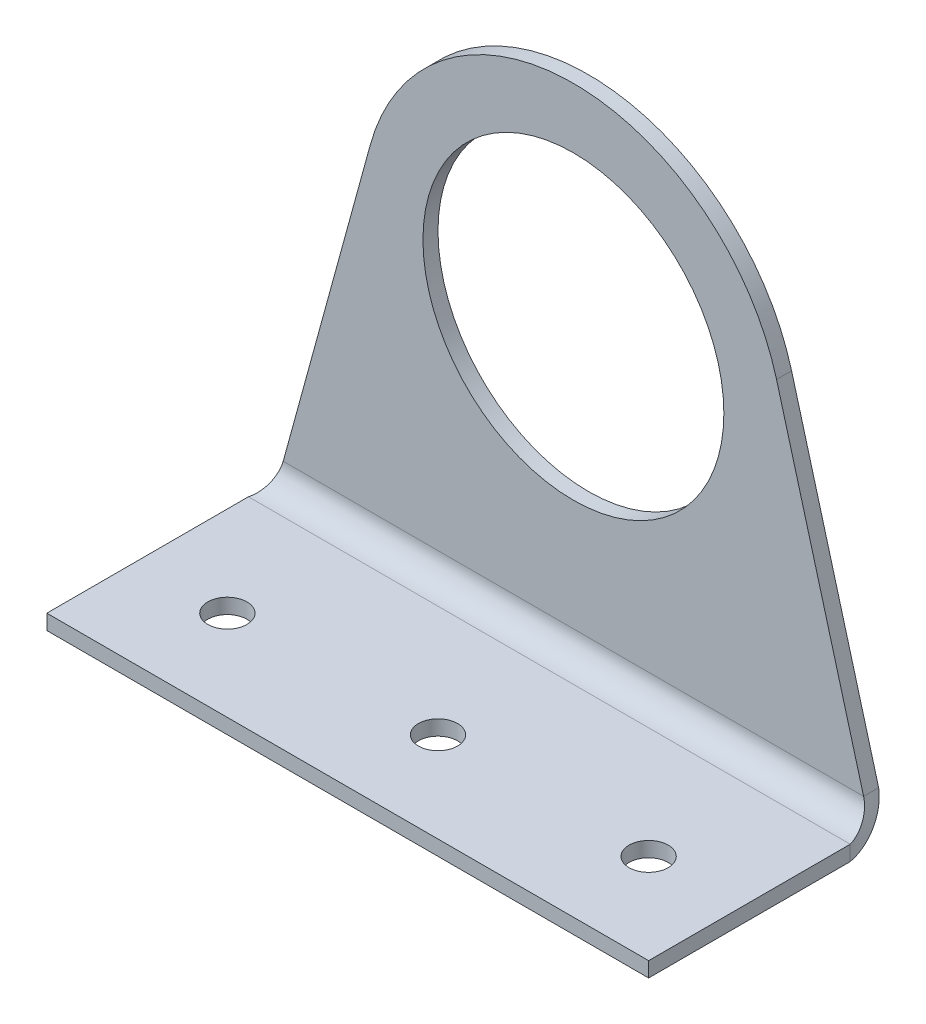
ISO-10303-21;
HEADER;
FILE_DESCRIPTION(('STEP AP214'),'2;1');
FILE_NAME('part.step','',(''),(''),'','','');
FILE_SCHEMA(('AUTOMOTIVE_DESIGN { 1 0 10303 214 1 1 1 1 }'));
ENDSEC;
DATA;
#1=APPLICATION_CONTEXT('core data for automotive mechanical design processes');
#2=APPLICATION_PROTOCOL_DEFINITION('international standard','automotive_design',2000,#1);
#3=PRODUCT_CONTEXT('',#1,'mechanical');
#4=PRODUCT('Part','Part','',(#3));
#5=PRODUCT_RELATED_PRODUCT_CATEGORY('part','',(#4));
#6=PRODUCT_DEFINITION_FORMATION('','',#4);
#7=PRODUCT_DEFINITION_CONTEXT('part definition',#1,'design');
#8=PRODUCT_DEFINITION('design','',#6,#7);
#9=PRODUCT_DEFINITION_SHAPE('','',#8);
#10=(LENGTH_UNIT() NAMED_UNIT(*) SI_UNIT(.MILLI.,.METRE.));
#11=(NAMED_UNIT(*) PLANE_ANGLE_UNIT() SI_UNIT($,.RADIAN.));
#12=(NAMED_UNIT(*) SI_UNIT($,.STERADIAN.) SOLID_ANGLE_UNIT());
#13=UNCERTAINTY_MEASURE_WITH_UNIT(LENGTH_MEASURE(1.E-05),#10,'distance_accuracy_value','');
#14=(GEOMETRIC_REPRESENTATION_CONTEXT(3) GLOBAL_UNCERTAINTY_ASSIGNED_CONTEXT((#13)) GLOBAL_UNIT_ASSIGNED_CONTEXT((#10,
#11,#12)) REPRESENTATION_CONTEXT('',''));
#15=CARTESIAN_POINT('',(0.,0.,0.));
#16=DIRECTION('',(0.,0.,1.));
#17=DIRECTION('',(1.,0.,0.));
#18=AXIS2_PLACEMENT_3D('',#15,#16,#17);
#19=CARTESIAN_POINT('',(-100.,-100.,-5.));
#20=DIRECTION('',(-0.964410286372228,0.264410286372226,0.));
#21=DIRECTION('',(-0.264410286372226,-0.964410286372228,0.));
#22=AXIS2_PLACEMENT_3D('',#19,#20,#21);
#23=PLANE('',#22);
#24=DIRECTION('',(-0.264410286372226,-0.964410286372228,0.));
#25=VECTOR('',#24,1.);
#26=CARTESIAN_POINT('',(-100.,-100.,-5.));
#27=LINE('',#26,#25);
#28=CARTESIAN_POINT('',(-67.5087200460559,18.5087200460559,-5.));
#29=VERTEX_POINT('',#28);
#30=CARTESIAN_POINT('',(-96.4358180626954,-87.,-5.));
#31=VERTEX_POINT('',#30);
#32=EDGE_CURVE('E115',#29,#31,#27,.T.);
#33=ORIENTED_EDGE('',*,*,#32,.T.);
#34=DIRECTION('',(0.,0.,-1.));
#35=VECTOR('',#34,1.);
#36=CARTESIAN_POINT('',(-96.4358180626954,-87.,0.));
#37=LINE('',#36,#35);
#38=CARTESIAN_POINT('',(-96.4358180626954,-87.,0.));
#39=VERTEX_POINT('',#38);
#40=EDGE_CURVE('E108',#39,#31,#37,.T.);
#41=ORIENTED_EDGE('',*,*,#40,.F.);
#42=DIRECTION('',(-0.264410286372226,-0.964410286372228,0.));
#43=VECTOR('',#42,1.);
#44=CARTESIAN_POINT('',(-100.,-100.,0.));
#45=LINE('',#44,#43);
#46=CARTESIAN_POINT('',(-67.5087200460559,18.5087200460559,0.));
#47=VERTEX_POINT('',#46);
#48=EDGE_CURVE('E102',#47,#39,#45,.T.);
#49=ORIENTED_EDGE('',*,*,#48,.F.);
#50=DIRECTION('',(0.,0.,1.));
#51=VECTOR('',#50,1.);
#52=CARTESIAN_POINT('',(-67.5087200460559,18.5087200460559,-5.));
#53=LINE('',#52,#51);
#54=EDGE_CURVE('E13',#29,#47,#53,.T.);
#55=ORIENTED_EDGE('',*,*,#54,.F.);
#56=EDGE_LOOP('',(#33,#41,#49,#55));
#57=FACE_BOUND('',#56,.T.);
#58=ADVANCED_FACE('F60',(#57),#23,.T.);
#59=CARTESIAN_POINT('',(100.,-100.,-5.));
#60=DIRECTION('',(0.964410286372228,0.264410286372226,0.));
#61=DIRECTION('',(-0.264410286372226,0.964410286372228,0.));
#62=AXIS2_PLACEMENT_3D('',#59,#60,#61);
#63=PLANE('',#62);
#64=DIRECTION('',(-0.264410286372226,0.964410286372228,0.));
#65=VECTOR('',#64,1.);
#66=CARTESIAN_POINT('',(100.,-100.,0.));
#67=LINE('',#66,#65);
#68=CARTESIAN_POINT('',(96.4358180626954,-87.,0.));
#69=VERTEX_POINT('',#68);
#70=CARTESIAN_POINT('',(67.5087200460559,18.5087200460559,0.));
#71=VERTEX_POINT('',#70);
#72=EDGE_CURVE('E103',#69,#71,#67,.T.);
#73=ORIENTED_EDGE('',*,*,#72,.F.);
#74=DIRECTION('',(0.,0.,-1.));
#75=VECTOR('',#74,1.);
#76=CARTESIAN_POINT('',(96.4358180626955,-87.,0.));
#77=LINE('',#76,#75);
#78=CARTESIAN_POINT('',(96.4358180626955,-87.0000000000002,-5.));
#79=VERTEX_POINT('',#78);
#80=EDGE_CURVE('E176',#69,#79,#77,.T.);
#81=ORIENTED_EDGE('',*,*,#80,.T.);
#82=DIRECTION('',(-0.264410286372226,0.964410286372228,0.));
#83=VECTOR('',#82,1.);
#84=CARTESIAN_POINT('',(100.,-100.,-5.));
#85=LINE('',#84,#83);
#86=CARTESIAN_POINT('',(67.5087200460559,18.5087200460559,-5.));
#87=VERTEX_POINT('',#86);
#88=EDGE_CURVE('E109',#79,#87,#85,.T.);
#89=ORIENTED_EDGE('',*,*,#88,.T.);
#90=DIRECTION('',(0.,0.,1.));
#91=VECTOR('',#90,1.);
#92=CARTESIAN_POINT('',(67.5087200460559,18.5087200460559,-5.));
#93=LINE('',#92,#91);
#94=EDGE_CURVE('E64',#87,#71,#93,.T.);
#95=ORIENTED_EDGE('',*,*,#94,.T.);
#96=EDGE_LOOP('',(#73,#81,#89,#95));
#97=FACE_BOUND('',#96,.T.);
#98=ADVANCED_FACE('F62',(#97),#63,.T.);
#99=CARTESIAN_POINT('',(0.,0.,-5.));
#100=DIRECTION('',(0.,0.,1.));
#101=DIRECTION('',(1.,0.,0.));
#102=AXIS2_PLACEMENT_3D('',#99,#100,#101);
#103=PLANE('',#102);
#104=CARTESIAN_POINT('',(0.,0.,-5.));
#105=DIRECTION('',(0.,0.,1.));
#106=DIRECTION('',(1.,0.,0.));
#107=AXIS2_PLACEMENT_3D('',#104,#105,#106);
#108=CIRCLE('',#107,50.);
#109=CARTESIAN_POINT('',(50.0000000000001,0.,-5.));
#110=VERTEX_POINT('',#109);
#111=EDGE_CURVE('E114',#110,#110,#108,.T.);
#112=ORIENTED_EDGE('',*,*,#111,.T.);
#113=EDGE_LOOP('',(#112));
#114=FACE_BOUND('',#113,.T.);
#115=DIRECTION('',(1.,0.,0.));
#116=VECTOR('',#115,1.);
#117=CARTESIAN_POINT('',(100.,-87.0000000000002,-5.));
#118=LINE('',#117,#116);
#119=EDGE_CURVE('E177',#79,#31,#118,.F.);
#120=ORIENTED_EDGE('',*,*,#119,.T.);
#121=ORIENTED_EDGE('',*,*,#32,.F.);
#122=CARTESIAN_POINT('',(0.,0.,-5.));
#123=DIRECTION('',(0.,0.,1.));
#124=DIRECTION('',(1.,0.,0.));
#125=AXIS2_PLACEMENT_3D('',#122,#123,#124);
#126=CIRCLE('',#125,70.);
#127=EDGE_CURVE('E98',#87,#29,#126,.T.);
#128=ORIENTED_EDGE('',*,*,#127,.F.);
#129=ORIENTED_EDGE('',*,*,#88,.F.);
#130=EDGE_LOOP('',(#120,#121,#128,#129));
#131=FACE_BOUND('',#130,.T.);
#132=ADVANCED_FACE('F213',(#114,#131),#103,.F.);
#133=CARTESIAN_POINT('',(0.,0.,0.));
#134=DIRECTION('',(0.,0.,1.));
#135=DIRECTION('',(1.,0.,0.));
#136=AXIS2_PLACEMENT_3D('',#133,#134,#135);
#137=PLANE('',#136);
#138=CARTESIAN_POINT('',(0.,0.,0.));
#139=DIRECTION('',(0.,0.,1.));
#140=DIRECTION('',(1.,0.,0.));
#141=AXIS2_PLACEMENT_3D('',#138,#139,#140);
#142=CIRCLE('',#141,50.);
#143=CARTESIAN_POINT('',(50.0000000000001,0.,0.));
#144=VERTEX_POINT('',#143);
#145=EDGE_CURVE('E118',#144,#144,#142,.T.);
#146=ORIENTED_EDGE('',*,*,#145,.F.);
#147=EDGE_LOOP('',(#146));
#148=FACE_BOUND('',#147,.T.);
#149=ORIENTED_EDGE('',*,*,#48,.T.);
#150=DIRECTION('',(1.,0.,0.));
#151=VECTOR('',#150,1.);
#152=CARTESIAN_POINT('',(100.,-87.,0.));
#153=LINE('',#152,#151);
#154=EDGE_CURVE('E75',#69,#39,#153,.F.);
#155=ORIENTED_EDGE('',*,*,#154,.F.);
#156=ORIENTED_EDGE('',*,*,#72,.T.);
#157=CARTESIAN_POINT('',(0.,0.,0.));
#158=DIRECTION('',(0.,0.,1.));
#159=DIRECTION('',(1.,0.,0.));
#160=AXIS2_PLACEMENT_3D('',#157,#158,#159);
#161=CIRCLE('',#160,70.);
#162=EDGE_CURVE('E96',#71,#47,#161,.T.);
#163=ORIENTED_EDGE('',*,*,#162,.T.);
#164=EDGE_LOOP('',(#149,#155,#156,#163));
#165=FACE_BOUND('',#164,.T.);
#166=ADVANCED_FACE('F100',(#148,#165),#137,.T.);
#167=CARTESIAN_POINT('',(0.,0.,-5.));
#168=DIRECTION('',(0.,0.,1.));
#169=DIRECTION('',(1.,0.,0.));
#170=AXIS2_PLACEMENT_3D('',#167,#168,#169);
#171=CYLINDRICAL_SURFACE('',#170,70.);
#172=ORIENTED_EDGE('',*,*,#162,.F.);
#173=ORIENTED_EDGE('',*,*,#94,.F.);
#174=ORIENTED_EDGE('',*,*,#127,.T.);
#175=ORIENTED_EDGE('',*,*,#54,.T.);
#176=EDGE_LOOP('',(#172,#173,#174,#175));
#177=FACE_BOUND('',#176,.T.);
#178=ADVANCED_FACE('F94',(#177),#171,.T.);
#179=CARTESIAN_POINT('',(0.,0.,-5.));
#180=DIRECTION('',(0.,0.,1.));
#181=DIRECTION('',(1.,0.,0.));
#182=AXIS2_PLACEMENT_3D('',#179,#180,#181);
#183=CYLINDRICAL_SURFACE('',#182,50.);
#184=ORIENTED_EDGE('',*,*,#111,.F.);
#185=EDGE_LOOP('',(#184));
#186=FACE_BOUND('',#185,.T.);
#187=ORIENTED_EDGE('',*,*,#145,.T.);
#188=EDGE_LOOP('',(#187));
#189=FACE_BOUND('',#188,.T.);
#190=ADVANCED_FACE('F160',(#186,#189),#183,.F.);
#191=CARTESIAN_POINT('',(-96.4358180626954,-87.,-5.05));
#192=CARTESIAN_POINT('',(-96.7328852160306,-88.7085399759597,-5.05));
#193=CARTESIAN_POINT('',(-97.0298483855796,-90.4158098908887,-4.71034343052151));
#194=CARTESIAN_POINT('',(-97.6238787084637,-93.5722276938402,-3.40291236802309));
#195=CARTESIAN_POINT('',(-97.9208938699058,-95.0198346956728,-2.43565229329629));
#196=CARTESIAN_POINT('',(-98.51492419279,-97.4356522932962,-0.0198346956726825));
#197=CARTESIAN_POINT('',(-98.811939354232,-98.402912368023,1.4277723061597));
#198=CARTESIAN_POINT('',(-99.4059696771162,-99.7103434305215,4.58419010911137));
#199=CARTESIAN_POINT('',(-99.7029328466652,-100.05,6.2914600240403));
#200=CARTESIAN_POINT('',(-100.,-100.05,7.99999999999995));
#201=CARTESIAN_POINT('',(-96.4358180626954,-87.,-5.));
#202=CARTESIAN_POINT('',(-96.7328851919906,-88.7019937613496,-5.));
#203=CARTESIAN_POINT('',(-97.0298483855796,-90.4027224966706,-4.66164479668812));
#204=CARTESIAN_POINT('',(-97.6238787084637,-93.5470467448218,-3.35922304860536));
#205=CARTESIAN_POINT('',(-97.9208938699058,-94.989107359674,-2.39566895117638));
#206=CARTESIAN_POINT('',(-98.51492419279,-97.3956689511763,0.0108926403260545));
#207=CARTESIAN_POINT('',(-98.811939354232,-98.3592230486054,1.45295325517825));
#208=CARTESIAN_POINT('',(-99.4059696771162,-99.661644796688,4.59727750332933));
#209=CARTESIAN_POINT('',(-99.7029328707052,-100.,6.2980062386504));
#210=CARTESIAN_POINT('',(-100.,-100.,7.99999999999995));
#211=CARTESIAN_POINT('',(-96.4358180626954,-87.,0.));
#212=CARTESIAN_POINT('',(-96.7328827879896,-88.0473723003383,0.));
#213=CARTESIAN_POINT('',(-97.0298483855796,-89.0939830748743,0.208218586653486));
#214=CARTESIAN_POINT('',(-97.6238787084637,-91.0289518429672,1.00970889316593));
#215=CARTESIAN_POINT('',(-97.9208938699058,-91.9163737597994,1.60266526081454));
#216=CARTESIAN_POINT('',(-98.51492419279,-93.3973347391854,3.08362624020064));
#217=CARTESIAN_POINT('',(-98.811939354232,-93.9902911068342,3.97104815703281));
#218=CARTESIAN_POINT('',(-99.4059696771162,-94.7917814133465,5.90601692512571));
#219=CARTESIAN_POINT('',(-99.7029352747062,-95.,6.95262769966171));
#220=CARTESIAN_POINT('',(-100.,-95.,7.99999999999995));
#221=CARTESIAN_POINT('',(-96.4358180626954,-87.,0.0505000000000089));
#222=CARTESIAN_POINT('',(-96.7328827637092,-88.040760623582,0.0505000000000089));
#223=CARTESIAN_POINT('',(-97.0298483855796,-89.0807648067142,0.25740420682524));
#224=CARTESIAN_POINT('',(-97.6238787084637,-91.0035190844585,1.05383510577783));
#225=CARTESIAN_POINT('',(-97.9208938699058,-91.8853391504406,1.64304843635565));
#226=CARTESIAN_POINT('',(-98.51492419279,-93.3569515636443,3.11466084955941));
#227=CARTESIAN_POINT('',(-98.811939354232,-93.9461648942221,3.9964809155415));
#228=CARTESIAN_POINT('',(-99.4059696771162,-94.7425957931749,5.91923519328585));
#229=CARTESIAN_POINT('',(-99.7029352989866,-94.9495,6.9592393764179));
#230=CARTESIAN_POINT('',(-100.,-94.9495,7.99999999999995));
#231=B_SPLINE_SURFACE_WITH_KNOTS('',1,3,((#191,#192,#193,#194,#195,#196,#197,#198,#199,#200),
(#201,#202,#203,#204,#205,#206,#207,#208,#209,#210),(#211,#212,#213,#214,#215,#216,#217,#218,
#219,#220),(#221,#222,#223,#224,#225,#226,#227,#228,#229,#230)),.UNSPECIFIED.,.F.,.F.,.F.,(2,1,
1,2),(4,2,2,2,4),(-0.01,0.,1.,1.0101),(0.,0.25,0.5,0.75,1.),.UNSPECIFIED.);
#232=DIRECTION('',(0.,1.,0.));
#233=VECTOR('',#232,1.);
#234=CARTESIAN_POINT('',(-100.,-100.,7.99999999999995));
#235=LINE('',#234,#233);
#236=CARTESIAN_POINT('',(-100.,-95.,7.99999999999995));
#237=VERTEX_POINT('',#236);
#238=CARTESIAN_POINT('',(-100.,-100.,7.99999999999995));
#239=VERTEX_POINT('',#238);
#240=EDGE_CURVE('E199',#237,#239,#235,.F.);
#241=CARTESIAN_POINT('',(-96.4358180626954,-87.,0.));
#242=CARTESIAN_POINT('',(-96.4945969012884,-87.2072319076827,-1.71775270816055E-05));
#243=CARTESIAN_POINT('',(-96.5533753252804,-87.4144608616571,0.00805155616721182));
#244=CARTESIAN_POINT('',(-96.6709231690331,-87.8276449823461,0.0402346459212886));
#245=CARTESIAN_POINT('',(-96.7296925890291,-88.0336002986182,0.0643470804922788));
#246=CARTESIAN_POINT('',(-96.8472378934936,-88.4430528120565,0.128496648311656));
#247=CARTESIAN_POINT('',(-96.906013777457,-88.6465496036293,0.168536373166315));
#248=CARTESIAN_POINT('',(-97.0235721230227,-89.0498317935349,0.264294180625364));
#249=CARTESIAN_POINT('',(-97.0823545847571,-89.2496168723595,0.320013606349887));
#250=CARTESIAN_POINT('',(-97.207447350635,-89.6695183392041,0.45491465712044));
#251=CARTESIAN_POINT('',(-97.273758753586,-89.8889664246789,0.536185769064113));
#252=CARTESIAN_POINT('',(-97.406406241626,-90.3199813046811,0.717663271891815));
#253=CARTESIAN_POINT('',(-97.4727423262113,-90.5315449791185,0.81787706565895));
#254=CARTESIAN_POINT('',(-97.6053980573418,-90.945045421349,1.0364311524986));
#255=CARTESIAN_POINT('',(-97.6717177046321,-91.1469839923188,1.15476803273342));
#256=CARTESIAN_POINT('',(-97.8043549979286,-91.5397222310927,1.40867232619233));
#257=CARTESIAN_POINT('',(-97.8706726439308,-91.7305218782636,1.54423977133185));
#258=CARTESIAN_POINT('',(-98.0033221379967,-92.0995367634602,1.83157918191999));
#259=CARTESIAN_POINT('',(-98.0696539868098,-92.2777504909595,1.98335308694941));
#260=CARTESIAN_POINT('',(-98.2022953011975,-92.6201449674092,2.30187527275759));
#261=CARTESIAN_POINT('',(-98.268604767104,-92.7843302150875,2.46861871758118));
#262=CARTESIAN_POINT('',(-98.4012475914582,-93.097526628721,2.81590285398149));
#263=CARTESIAN_POINT('',(-98.4675809499809,-93.2465323542353,2.9964484520426));
#264=CARTESIAN_POINT('',(-98.6002404194969,-93.528155659011,3.36989460138489));
#265=CARTESIAN_POINT('',(-98.6665665306045,-93.6607735515952,3.5627949163462));
#266=CARTESIAN_POINT('',(-98.7992417451299,-93.9086390141941,3.95952600129387));
#267=CARTESIAN_POINT('',(-98.8655908497034,-94.0238816116072,4.16335987779253));
#268=CARTESIAN_POINT('',(-98.9982901116905,-94.2360637278296,4.58033535213285));
#269=CARTESIAN_POINT('',(-99.064640269078,-94.3330034913114,4.79347682550356));
#270=CARTESIAN_POINT('',(-99.197304610951,-94.507786650664,5.22731352854905));
#271=CARTESIAN_POINT('',(-99.2636187940671,-94.585641049549,5.4480043218907));
#272=CARTESIAN_POINT('',(-99.3962169011965,-94.7217069995969,5.89526982261124));
#273=CARTESIAN_POINT('',(-99.4625008284417,-94.7799241570931,6.12184283071937));
#274=CARTESIAN_POINT('',(-99.6073888410977,-94.8852449562198,6.621727194962));
#275=CARTESIAN_POINT('',(-99.6859976000523,-94.9282841221728,6.8959124783317));
#276=CARTESIAN_POINT('',(-99.8038216838288,-94.9713123583205,7.30909252593587));
#277=CARTESIAN_POINT('',(-99.8430564913757,-94.982066674368,7.44704746263087));
#278=CARTESIAN_POINT('',(-99.9215253291133,-94.9964100977332,7.72332608894549));
#279=CARTESIAN_POINT('',(-99.9607593593009,-94.9999993723549,7.86164976987939));
#280=CARTESIAN_POINT('',(-100.,-95.,7.99999999999995));
#281=B_SPLINE_CURVE_WITH_KNOTS('',3,(#241,#242,#243,#244,#245,#246,#247,#248,#249,#250,#251,
#252,#253,#254,#255,#256,#257,#258,#259,#260,#261,#262,#263,#264,#265,#266,#267,#268,#269,#270,
#271,#272,#273,#274,#275,#276,#277,#278,#279,#280),.UNSPECIFIED.,.F.,.F.,(4,2,2,2,2,2,2,2,2,2,2,
2,2,2,2,2,2,2,2,4),(0.,0.64606420756709,1.29205105257637,1.93814305224702,2.5842904128886,
3.31309074409137,4.04217648473594,4.77112509649658,5.50007505847729,6.22911235880187,
6.95791498313815,7.68697790289453,8.41602688136544,9.14528411050125,9.87453159022915,
10.6033576532785,11.3319754637095,12.1957441163657,12.627077507067,13.0584008259972),.UNSPECIFIED.);
#282=EDGE_CURVE('E133',#39,#237,#281,.T.);
#283=CARTESIAN_POINT('',(-96.4358180626954,-87.,-5.));
#284=CARTESIAN_POINT('',(-96.5006064376644,-87.3711787812864,-5.00004173230086));
#285=CARTESIAN_POINT('',(-96.5653937274682,-87.742351674118,-4.98410478948432));
#286=CARTESIAN_POINT('',(-96.6949622980846,-88.4819613166323,-4.92057493732212));
#287=CARTESIAN_POINT('',(-96.7597435790359,-88.85039820091,-4.87298359575162));
#288=CARTESIAN_POINT('',(-96.8892530950172,-89.5815686466523,-4.74649473280719));
#289=CARTESIAN_POINT('',(-96.9539813326736,-89.9443063602377,-4.66762121719314));
#290=CARTESIAN_POINT('',(-97.0834428818733,-90.6617068059029,-4.47915969109215));
#291=CARTESIAN_POINT('',(-97.148176193343,-91.0163696388183,-4.36957206437751));
#292=CARTESIAN_POINT('',(-97.2776795882725,-91.7152295856603,-4.12040905104718));
#293=CARTESIAN_POINT('',(-97.3424496715774,-92.0594205946,-3.9808165402682));
#294=CARTESIAN_POINT('',(-97.4719910579249,-92.7346020211582,-3.67270488404615));
#295=CARTESIAN_POINT('',(-97.5367623609679,-93.0655924356042,-3.50418573165114));
#296=CARTESIAN_POINT('',(-97.6662862435762,-93.7118855115692,-3.13949014738295));
#297=CARTESIAN_POINT('',(-97.7310388243419,-94.0271911901371,-2.94331906256689));
#298=CARTESIAN_POINT('',(-97.8605449319293,-94.6398704578854,-2.52473400735792));
#299=CARTESIAN_POINT('',(-97.9252984587437,-94.9372441496174,-2.30232018706687));
#300=CARTESIAN_POINT('',(-98.0548091032205,-95.5118751449353,-1.83288466497434));
#301=CARTESIAN_POINT('',(-98.1195662207498,-95.7891329600928,-1.58586358934523));
#302=CARTESIAN_POINT('',(-98.2490796868199,-96.3215120296624,-1.06901614907857));
#303=CARTESIAN_POINT('',(-98.3138360353535,-96.5766331483404,-0.799189644626525));
#304=CARTESIAN_POINT('',(-98.4433636269666,-97.0629295433855,-0.238638188947338));
#305=CARTESIAN_POINT('',(-98.5081348696745,-97.294098752029,0.0520920263610922));
#306=CARTESIAN_POINT('',(-98.6376713581155,-97.7307195417678,0.65225448276598));
#307=CARTESIAN_POINT('',(-98.7024366039369,-97.9361715952936,0.961686380153108));
#308=CARTESIAN_POINT('',(-98.8319896329333,-98.3199073142058,1.59707291882664));
#309=CARTESIAN_POINT('',(-98.8967774175319,-98.49818376387,1.92303191791285));
#310=CARTESIAN_POINT('',(-99.0263535978137,-98.8261963374642,2.58900512564825));
#311=CARTESIAN_POINT('',(-99.091141993498,-98.9759323954461,2.9290193667726));
#312=CARTESIAN_POINT('',(-99.2206815142384,-99.2456831117695,3.62040698403881));
#313=CARTESIAN_POINT('',(-99.2854326375976,-99.3657160709602,3.97177321427915));
#314=CARTESIAN_POINT('',(-99.4149044647164,-99.575268517349,4.68334504776885));
#315=CARTESIAN_POINT('',(-99.479625171854,-99.6647968354026,5.04354806041355));
#316=CARTESIAN_POINT('',(-99.6203548599913,-99.8256174770895,5.83366954601029));
#317=CARTESIAN_POINT('',(-99.6963680804368,-99.8910242614474,6.26481084306279));
#318=CARTESIAN_POINT('',(-99.8103018124788,-99.9564100130807,6.91428532013413));
#319=CARTESIAN_POINT('',(-99.8482406405211,-99.9727511787564,7.13109483388313));
#320=CARTESIAN_POINT('',(-99.9241175966369,-99.9945455436847,7.56525608383064));
#321=CARTESIAN_POINT('',(-99.9620557247089,-99.9999989619751,7.78260780903297));
#322=CARTESIAN_POINT('',(-100.,-100.,7.99999999999995));
#323=B_SPLINE_CURVE_WITH_KNOTS('',3,(#283,#284,#285,#286,#287,#288,#289,#290,#291,#292,#293,
#294,#295,#296,#297,#298,#299,#300,#301,#302,#303,#304,#305,#306,#307,#308,#309,#310,#311,#312,
#313,#314,#315,#316,#317,#318,#319,#320,#321,#322),.UNSPECIFIED.,.F.,.F.,(4,2,2,2,2,2,2,2,2,2,2,
2,2,2,2,2,2,2,2,4),(0.,1.13002673266509,2.25999750167241,3.38910281023901,4.51819401128222,
5.64793131791564,6.77766889605978,7.90718831565168,9.03670127498909,10.1661854993373,
11.2956766487795,12.4254532355507,13.5552090650049,14.6852643489901,15.815322244157,
16.9446821380349,18.0737148127035,19.3992429872366,20.0611436536244,20.7230310038745),.UNSPECIFIED.);
#324=EDGE_CURVE('E169',#31,#239,#323,.T.);
#325=ORIENTED_EDGE('',*,*,#240,.F.);
#326=ORIENTED_EDGE('',*,*,#282,.F.);
#327=ORIENTED_EDGE('',*,*,#40,.T.);
#328=ORIENTED_EDGE('',*,*,#324,.T.);
#329=EDGE_LOOP('',(#325,#326,#327,#328));
#330=FACE_BOUND('',#329,.T.);
#331=ADVANCED_FACE('F154',(#330),#231,.F.);
#332=CARTESIAN_POINT('',(100.,-100.05,7.99999999999995));
#333=CARTESIAN_POINT('',(99.7029328466652,-100.05,6.2914600240403));
#334=CARTESIAN_POINT('',(99.4059696771162,-99.7103434305215,4.58419010911137));
#335=CARTESIAN_POINT('',(98.8119393542321,-98.4029123680232,1.42777230615976));
#336=CARTESIAN_POINT('',(98.51492419279,-97.4356522932964,-0.019834695672627));
#337=CARTESIAN_POINT('',(97.9208938699059,-95.0198346956728,-2.43565229329623));
#338=CARTESIAN_POINT('',(97.6238787084638,-93.5722276938402,-3.40291236802309));
#339=CARTESIAN_POINT('',(97.0298483855796,-90.4158098908887,-4.71034343052151));
#340=CARTESIAN_POINT('',(96.7328852160306,-88.7085399759597,-5.05));
#341=CARTESIAN_POINT('',(96.4358180626955,-87.0000000000002,-5.05));
#342=CARTESIAN_POINT('',(100.,-100.,7.99999999999995));
#343=CARTESIAN_POINT('',(99.7029328707052,-100.,6.2980062386504));
#344=CARTESIAN_POINT('',(99.4059696771162,-99.6616447966883,4.59727750332933));
#345=CARTESIAN_POINT('',(98.8119393542321,-98.3592230486054,1.4529532551783));
#346=CARTESIAN_POINT('',(98.51492419279,-97.3956689511763,0.01089264032611));
#347=CARTESIAN_POINT('',(97.9208938699059,-94.989107359674,-2.39566895117632));
#348=CARTESIAN_POINT('',(97.6238787084638,-93.5470467448218,-3.35922304860536));
#349=CARTESIAN_POINT('',(97.0298483855796,-90.4027224966708,-4.66164479668812));
#350=CARTESIAN_POINT('',(96.7328851919906,-88.7019937613496,-5.));
#351=CARTESIAN_POINT('',(96.4358180626955,-87.0000000000002,-5.));
#352=CARTESIAN_POINT('',(100.,-95.,7.99999999999995));
#353=CARTESIAN_POINT('',(99.7029352747062,-95.,6.95262769966171));
#354=CARTESIAN_POINT('',(99.4059696771162,-94.7917814133465,5.90601692512571));
#355=CARTESIAN_POINT('',(98.8119393542321,-93.9902911068342,3.97104815703281));
#356=CARTESIAN_POINT('',(98.51492419279,-93.3973347391854,3.08362624020064));
#357=CARTESIAN_POINT('',(97.9208938699059,-91.9163737597994,1.60266526081454));
#358=CARTESIAN_POINT('',(97.6238787084638,-91.0289518429672,1.00970889316593));
#359=CARTESIAN_POINT('',(97.0298483855796,-89.0939830748743,0.208218586653486));
#360=CARTESIAN_POINT('',(96.7328827879896,-88.0473723003383,0.));
#361=CARTESIAN_POINT('',(96.4358180626955,-87.,0.));
#362=CARTESIAN_POINT('',(100.,-94.9495,7.99999999999995));
#363=CARTESIAN_POINT('',(99.7029352989866,-94.9495,6.9592393764179));
#364=CARTESIAN_POINT('',(99.4059696771162,-94.7425957931749,5.91923519328585));
#365=CARTESIAN_POINT('',(98.8119393542321,-93.9461648942221,3.9964809155415));
#366=CARTESIAN_POINT('',(98.51492419279,-93.3569515636443,3.11466084955941));
#367=CARTESIAN_POINT('',(97.9208938699059,-91.8853391504406,1.64304843635565));
#368=CARTESIAN_POINT('',(97.6238787084638,-91.0035190844585,1.05383510577783));
#369=CARTESIAN_POINT('',(97.0298483855796,-89.0807648067142,0.25740420682524));
#370=CARTESIAN_POINT('',(96.7328827637092,-88.040760623582,0.0505000000000089));
#371=CARTESIAN_POINT('',(96.4358180626955,-87.,0.0505000000000089));
#372=B_SPLINE_SURFACE_WITH_KNOTS('',1,3,((#332,#333,#334,#335,#336,#337,#338,#339,#340,#341),
(#342,#343,#344,#345,#346,#347,#348,#349,#350,#351),(#352,#353,#354,#355,#356,#357,#358,#359,
#360,#361),(#362,#363,#364,#365,#366,#367,#368,#369,#370,#371)),.UNSPECIFIED.,.F.,.F.,.F.,(2,1,
1,2),(4,2,2,2,4),(-0.01,0.,1.,1.0101),(0.,0.25,0.5,0.75,1.),.UNSPECIFIED.);
#373=CARTESIAN_POINT('',(100.,-95.,7.99999999999995));
#374=CARTESIAN_POINT('',(99.9412211614074,-95.0000171775271,7.79276809231725));
#375=CARTESIAN_POINT('',(99.8824427374154,-94.9919484438328,7.58553913834281));
#376=CARTESIAN_POINT('',(99.7648948936627,-94.9597653540787,7.17235501765382));
#377=CARTESIAN_POINT('',(99.7061254736666,-94.9356529195077,6.9663997013818));
#378=CARTESIAN_POINT('',(99.5885801692022,-94.8715033516883,6.55694718794346));
#379=CARTESIAN_POINT('',(99.5298042852388,-94.8314636268337,6.35345039637064));
#380=CARTESIAN_POINT('',(99.4122459396731,-94.7357058193746,5.95016820646509));
#381=CARTESIAN_POINT('',(99.3534634779387,-94.6799863936501,5.7503831276405));
#382=CARTESIAN_POINT('',(99.2283707120608,-94.5450853428795,5.33048166079591));
#383=CARTESIAN_POINT('',(99.1620593091098,-94.4638142309359,5.11103357532113));
#384=CARTESIAN_POINT('',(99.0294118210698,-94.2823367281082,4.68001869531891));
#385=CARTESIAN_POINT('',(98.9630757364845,-94.1821229343411,4.4684550208816));
#386=CARTESIAN_POINT('',(98.8304200053539,-93.9635688475014,4.05495457865109));
#387=CARTESIAN_POINT('',(98.7641003580637,-93.8452319672666,3.85301600768124));
#388=CARTESIAN_POINT('',(98.6314630647672,-93.5913276738077,3.46027776890738));
#389=CARTESIAN_POINT('',(98.565145418765,-93.4557602286682,3.26947812173648));
#390=CARTESIAN_POINT('',(98.4324959246991,-93.16842081808,2.90046323653993));
#391=CARTESIAN_POINT('',(98.366164075886,-93.0166469130507,2.72224950904052));
#392=CARTESIAN_POINT('',(98.2335227614983,-92.6981247272425,2.37985503259086));
#393=CARTESIAN_POINT('',(98.1672132955919,-92.5313812824189,2.2156697849126));
#394=CARTESIAN_POINT('',(98.0345704712377,-92.1840971460186,1.9024733712791));
#395=CARTESIAN_POINT('',(97.968237112715,-92.0035515479575,1.75346764576472));
#396=CARTESIAN_POINT('',(97.8355776431989,-91.6301053986152,1.47184434098908));
#397=CARTESIAN_POINT('',(97.7692515320913,-91.4372050836539,1.33922644840492));
#398=CARTESIAN_POINT('',(97.6365763175659,-91.0404739987062,1.091360985806));
#399=CARTESIAN_POINT('',(97.5702272129924,-90.8366401222076,0.976118388392901));
#400=CARTESIAN_POINT('',(97.4375279510053,-90.4196646478673,0.763936272170475));
#401=CARTESIAN_POINT('',(97.3711777936178,-90.2065231744966,0.66699650868869));
#402=CARTESIAN_POINT('',(97.2385134517449,-89.7726864714511,0.492213349335997));
#403=CARTESIAN_POINT('',(97.1721992686288,-89.5519956781094,0.414358950451011));
#404=CARTESIAN_POINT('',(97.0396011614994,-89.1047301773889,0.278293000403119));
#405=CARTESIAN_POINT('',(96.9733172342542,-88.8781571692807,0.220075842907077));
#406=CARTESIAN_POINT('',(96.8284292215981,-88.378272805038,0.114755043780341));
#407=CARTESIAN_POINT('',(96.7498204626436,-88.1040875216683,0.0717158778271819));
#408=CARTESIAN_POINT('',(96.631996378867,-87.6909074740641,0.0286876416794819));
#409=CARTESIAN_POINT('',(96.5927615713201,-87.5529525373691,0.0179333256319649));
#410=CARTESIAN_POINT('',(96.5142927335825,-87.2766739110545,0.00358990226677435));
#411=CARTESIAN_POINT('',(96.4750587033949,-87.1383502301206,6.27645075247658E-07));
#412=CARTESIAN_POINT('',(96.4358180626955,-87.,0.));
#413=B_SPLINE_CURVE_WITH_KNOTS('',3,(#373,#374,#375,#376,#377,#378,#379,#380,#381,#382,#383,
#384,#385,#386,#387,#388,#389,#390,#391,#392,#393,#394,#395,#396,#397,#398,#399,#400,#401,#402,
#403,#404,#405,#406,#407,#408,#409,#410,#411,#412),.UNSPECIFIED.,.F.,.F.,(4,2,2,2,2,2,2,2,2,2,2,
2,2,2,2,2,2,2,2,4),(0.,0.646064207567071,1.29205105257634,1.93814305224696,2.58429041288854,
3.31309074409128,4.04217648473581,4.77112509649644,5.50007505847711,6.22911235880168,
6.95791498313794,7.68697790289431,8.4160268813652,9.14528411050102,9.87453159022892,
10.6033576532783,11.3319754637093,12.1957441163656,12.6270775070669,13.0584008259972),.UNSPECIFIED.);
#414=CARTESIAN_POINT('',(100.,-95.,7.99999999999995));
#415=VERTEX_POINT('',#414);
#416=EDGE_CURVE('E123',#415,#69,#413,.T.);
#417=DIRECTION('',(0.,1.,0.));
#418=VECTOR('',#417,1.);
#419=CARTESIAN_POINT('',(100.,-95.,7.99999999999995));
#420=LINE('',#419,#418);
#421=CARTESIAN_POINT('',(100.,-100.,7.99999999999995));
#422=VERTEX_POINT('',#421);
#423=EDGE_CURVE('E268',#415,#422,#420,.F.);
#424=CARTESIAN_POINT('',(100.,-100.,7.99999999999995));
#425=CARTESIAN_POINT('',(99.9352116250314,-100.000041732301,7.62882121871353));
#426=CARTESIAN_POINT('',(99.8704243352276,-99.9841047894843,7.25764832588197));
#427=CARTESIAN_POINT('',(99.7408557646111,-99.9205749373221,6.51803868336767));
#428=CARTESIAN_POINT('',(99.6760744836599,-99.8729835957516,6.14960179909001));
#429=CARTESIAN_POINT('',(99.5465649676786,-99.7464947328072,5.41843135334773));
#430=CARTESIAN_POINT('',(99.4818367300222,-99.6676212171931,5.0556936397623));
#431=CARTESIAN_POINT('',(99.3523751808225,-99.4791596910921,4.33829319409713));
#432=CARTESIAN_POINT('',(99.2876418693528,-99.3695720643775,3.98363036118177));
#433=CARTESIAN_POINT('',(99.1581384744233,-99.1204090510472,3.2847704143398));
#434=CARTESIAN_POINT('',(99.0933683911184,-98.9808165402682,2.9405794054001));
#435=CARTESIAN_POINT('',(98.9638270047708,-98.6727048840462,2.26539797884187));
#436=CARTESIAN_POINT('',(98.8990557017279,-98.5041857316512,1.93440756439586));
#437=CARTESIAN_POINT('',(98.7695318191196,-98.139490147383,1.28811448843088));
#438=CARTESIAN_POINT('',(98.704779238354,-97.943319062567,0.972808809862915));
#439=CARTESIAN_POINT('',(98.5752731307665,-97.5247340073579,0.360129542114723));
#440=CARTESIAN_POINT('',(98.5105196039522,-97.3023201870668,0.0627558503827368));
#441=CARTESIAN_POINT('',(98.3810089594753,-96.8328846649743,-0.511875144935159));
#442=CARTESIAN_POINT('',(98.316251841946,-96.5858635893453,-0.789132960092718));
#443=CARTESIAN_POINT('',(98.1867383758759,-96.0690161490787,-1.32151202966237));
#444=CARTESIAN_POINT('',(98.1219820273423,-95.7991896446266,-1.57663314834035));
#445=CARTESIAN_POINT('',(97.9924544357292,-95.2386381889474,-2.06292954338544));
#446=CARTESIAN_POINT('',(97.9276831930213,-94.947907973639,-2.29409875202893));
#447=CARTESIAN_POINT('',(97.7981467045803,-94.3477455172341,-2.73071954176778));
#448=CARTESIAN_POINT('',(97.7333814587589,-94.038313619847,-2.93617159529353));
#449=CARTESIAN_POINT('',(97.6038284297625,-93.4029270811735,-3.31990731420582));
#450=CARTESIAN_POINT('',(97.5390406451639,-93.0769680820873,-3.49818376386997));
#451=CARTESIAN_POINT('',(97.4094644648821,-92.4109948743519,-3.82619633746415));
#452=CARTESIAN_POINT('',(97.3446760691978,-92.0709806332275,-3.97593239544603));
#453=CARTESIAN_POINT('',(97.2151365484574,-91.3795930159613,-4.24568311176947));
#454=CARTESIAN_POINT('',(97.1503854250982,-91.028226785721,-4.36571607096015));
#455=CARTESIAN_POINT('',(97.0209135979794,-90.3166549522313,-4.57526851734895));
#456=CARTESIAN_POINT('',(96.9561928908419,-89.9564519395866,-4.66479683540263));
#457=CARTESIAN_POINT('',(96.8154632027046,-89.1663304539898,-4.82561747708951));
#458=CARTESIAN_POINT('',(96.739449982259,-88.7351891569374,-4.89102426144743));
#459=CARTESIAN_POINT('',(96.6255162502171,-88.085714679866,-4.95641001308072));
#460=CARTESIAN_POINT('',(96.5875774221747,-87.868905166117,-4.97275117875644));
#461=CARTESIAN_POINT('',(96.511700466059,-87.4347439161695,-4.99454554368471));
#462=CARTESIAN_POINT('',(96.4737623379869,-87.2173921909672,-4.9999989619751));
#463=CARTESIAN_POINT('',(96.4358180626955,-87.0000000000002,-5.));
#464=B_SPLINE_CURVE_WITH_KNOTS('',3,(#424,#425,#426,#427,#428,#429,#430,#431,#432,#433,#434,
#435,#436,#437,#438,#439,#440,#441,#442,#443,#444,#445,#446,#447,#448,#449,#450,#451,#452,#453,
#454,#455,#456,#457,#458,#459,#460,#461,#462,#463),.UNSPECIFIED.,.F.,.F.,(4,2,2,2,2,2,2,2,2,2,2,
2,2,2,2,2,2,2,2,4),(0.,1.13002673266505,2.25999750167234,3.38910281023889,4.51819401128204,
5.64793131791546,6.7776688960596,7.90718831565149,9.0367012749889,10.1661854993371,
11.2956766487793,12.4254532355505,13.5552090650047,14.6852643489898,15.8153222441568,
16.9446821380347,18.0737148127033,19.3992429872364,20.0611436536242,20.7230310038743),.UNSPECIFIED.);
#465=EDGE_CURVE('E179',#422,#79,#464,.T.);
#466=ORIENTED_EDGE('',*,*,#416,.F.);
#467=ORIENTED_EDGE('',*,*,#423,.T.);
#468=ORIENTED_EDGE('',*,*,#465,.T.);
#469=ORIENTED_EDGE('',*,*,#80,.F.);
#470=EDGE_LOOP('',(#466,#467,#468,#469));
#471=FACE_BOUND('',#470,.T.);
#472=ADVANCED_FACE('F140',(#471),#372,.F.);
#473=CARTESIAN_POINT('',(100.,-87.,8.00000000000001));
#474=DIRECTION('',(1.,0.,0.));
#475=DIRECTION('',(0.,-1.,0.));
#476=AXIS2_PLACEMENT_3D('',#473,#474,#475);
#477=CYLINDRICAL_SURFACE('',#476,13.);
#478=ORIENTED_EDGE('',*,*,#119,.F.);
#479=ORIENTED_EDGE('',*,*,#465,.F.);
#480=DIRECTION('',(1.,0.,0.));
#481=VECTOR('',#480,1.);
#482=CARTESIAN_POINT('',(-100.,-100.,7.99999999999995));
#483=LINE('',#482,#481);
#484=EDGE_CURVE('E266',#422,#239,#483,.F.);
#485=ORIENTED_EDGE('',*,*,#484,.T.);
#486=ORIENTED_EDGE('',*,*,#324,.F.);
#487=EDGE_LOOP('',(#478,#479,#485,#486));
#488=FACE_BOUND('',#487,.T.);
#489=ADVANCED_FACE('F150',(#488),#477,.T.);
#490=CARTESIAN_POINT('',(100.,-87.,8.00000000000001));
#491=DIRECTION('',(1.,0.,0.));
#492=DIRECTION('',(0.,-1.,0.));
#493=AXIS2_PLACEMENT_3D('',#490,#491,#492);
#494=CYLINDRICAL_SURFACE('',#493,7.99999999999999);
#495=ORIENTED_EDGE('',*,*,#154,.T.);
#496=ORIENTED_EDGE('',*,*,#282,.T.);
#497=DIRECTION('',(1.,0.,0.));
#498=VECTOR('',#497,1.);
#499=CARTESIAN_POINT('',(-100.,-95.,7.99999999999995));
#500=LINE('',#499,#498);
#501=EDGE_CURVE('E269',#237,#415,#500,.T.);
#502=ORIENTED_EDGE('',*,*,#501,.T.);
#503=ORIENTED_EDGE('',*,*,#416,.T.);
#504=EDGE_LOOP('',(#495,#496,#502,#503));
#505=FACE_BOUND('',#504,.T.);
#506=ADVANCED_FACE('F145',(#505),#494,.F.);
#507=CARTESIAN_POINT('',(-100.,-100.,0.));
#508=DIRECTION('',(1.,0.,0.));
#509=DIRECTION('',(0.,0.,-1.));
#510=AXIS2_PLACEMENT_3D('',#507,#508,#509);
#511=PLANE('',#510);
#512=ORIENTED_EDGE('',*,*,#240,.T.);
#513=DIRECTION('',(0.,0.,-1.));
#514=VECTOR('',#513,1.);
#515=CARTESIAN_POINT('',(-100.,-100.,-3.88578058618805E-13));
#516=LINE('',#515,#514);
#517=CARTESIAN_POINT('',(-100.,-100.,75.));
#518=VERTEX_POINT('',#517);
#519=EDGE_CURVE('E241',#518,#239,#516,.T.);
#520=ORIENTED_EDGE('',*,*,#519,.F.);
#521=DIRECTION('',(0.,1.,0.));
#522=VECTOR('',#521,1.);
#523=CARTESIAN_POINT('',(-100.,-100.,75.));
#524=LINE('',#523,#522);
#525=CARTESIAN_POINT('',(-100.,-95.0000000000004,75.));
#526=VERTEX_POINT('',#525);
#527=EDGE_CURVE('E247',#518,#526,#524,.T.);
#528=ORIENTED_EDGE('',*,*,#527,.T.);
#529=DIRECTION('',(0.,0.,1.));
#530=VECTOR('',#529,1.);
#531=CARTESIAN_POINT('',(-100.,-95.,0.));
#532=LINE('',#531,#530);
#533=EDGE_CURVE('E264',#526,#237,#532,.F.);
#534=ORIENTED_EDGE('',*,*,#533,.T.);
#535=EDGE_LOOP('',(#512,#520,#528,#534));
#536=FACE_BOUND('',#535,.T.);
#537=ADVANCED_FACE('F149',(#536),#511,.F.);
#538=CARTESIAN_POINT('',(100.,-100.,75.));
#539=DIRECTION('',(-1.,0.,0.));
#540=DIRECTION('',(0.,0.,1.));
#541=AXIS2_PLACEMENT_3D('',#538,#539,#540);
#542=PLANE('',#541);
#543=ORIENTED_EDGE('',*,*,#423,.F.);
#544=DIRECTION('',(0.,0.,-1.));
#545=VECTOR('',#544,1.);
#546=CARTESIAN_POINT('',(100.,-95.0000000000004,75.));
#547=LINE('',#546,#545);
#548=CARTESIAN_POINT('',(100.,-95.0000000000004,75.));
#549=VERTEX_POINT('',#548);
#550=EDGE_CURVE('E260',#415,#549,#547,.F.);
#551=ORIENTED_EDGE('',*,*,#550,.T.);
#552=DIRECTION('',(0.,1.,0.));
#553=VECTOR('',#552,1.);
#554=CARTESIAN_POINT('',(100.,-100.,75.));
#555=LINE('',#554,#553);
#556=CARTESIAN_POINT('',(100.,-100.,75.));
#557=VERTEX_POINT('',#556);
#558=EDGE_CURVE('E132',#557,#549,#555,.T.);
#559=ORIENTED_EDGE('',*,*,#558,.F.);
#560=DIRECTION('',(0.,0.,1.));
#561=VECTOR('',#560,1.);
#562=CARTESIAN_POINT('',(100.,-100.,-3.88578058618805E-13));
#563=LINE('',#562,#561);
#564=EDGE_CURVE('E243',#422,#557,#563,.T.);
#565=ORIENTED_EDGE('',*,*,#564,.F.);
#566=EDGE_LOOP('',(#543,#551,#559,#565));
#567=FACE_BOUND('',#566,.T.);
#568=ADVANCED_FACE('F286',(#567),#542,.F.);
#569=CARTESIAN_POINT('',(0.,-100.,-3.88578058618805E-13));
#570=DIRECTION('',(0.,1.,0.));
#571=DIRECTION('',(0.,0.,1.));
#572=AXIS2_PLACEMENT_3D('',#569,#570,#571);
#573=PLANE('',#572);
#574=CARTESIAN_POINT('',(-70.0000000000002,-100.,45.));
#575=DIRECTION('',(0.,1.,0.));
#576=DIRECTION('',(0.,0.,1.));
#577=AXIS2_PLACEMENT_3D('',#574,#575,#576);
#578=CIRCLE('',#577,6.5);
#579=CARTESIAN_POINT('',(-70.0000000000002,-100.,51.5));
#580=VERTEX_POINT('',#579);
#581=EDGE_CURVE('E270',#580,#580,#578,.T.);
#582=ORIENTED_EDGE('',*,*,#581,.T.);
#583=EDGE_LOOP('',(#582));
#584=FACE_BOUND('',#583,.T.);
#585=CARTESIAN_POINT('',(70.0000000000002,-100.,45.));
#586=DIRECTION('',(0.,1.,0.));
#587=DIRECTION('',(0.,0.,1.));
#588=AXIS2_PLACEMENT_3D('',#585,#586,#587);
#589=CIRCLE('',#588,6.5);
#590=CARTESIAN_POINT('',(70.0000000000002,-100.,51.5));
#591=VERTEX_POINT('',#590);
#592=EDGE_CURVE('E272',#591,#591,#589,.T.);
#593=ORIENTED_EDGE('',*,*,#592,.T.);
#594=EDGE_LOOP('',(#593));
#595=FACE_BOUND('',#594,.T.);
#596=CARTESIAN_POINT('',(0.,-100.,45.));
#597=DIRECTION('',(0.,1.,0.));
#598=DIRECTION('',(0.,0.,1.));
#599=AXIS2_PLACEMENT_3D('',#596,#597,#598);
#600=CIRCLE('',#599,6.5);
#601=CARTESIAN_POINT('',(0.,-100.,51.5));
#602=VERTEX_POINT('',#601);
#603=EDGE_CURVE('E277',#602,#602,#600,.T.);
#604=ORIENTED_EDGE('',*,*,#603,.T.);
#605=EDGE_LOOP('',(#604));
#606=FACE_BOUND('',#605,.T.);
#607=ORIENTED_EDGE('',*,*,#484,.F.);
#608=ORIENTED_EDGE('',*,*,#564,.T.);
#609=DIRECTION('',(-1.,0.,0.));
#610=VECTOR('',#609,1.);
#611=CARTESIAN_POINT('',(0.,-100.,75.));
#612=LINE('',#611,#610);
#613=EDGE_CURVE('E236',#557,#518,#612,.T.);
#614=ORIENTED_EDGE('',*,*,#613,.T.);
#615=ORIENTED_EDGE('',*,*,#519,.T.);
#616=EDGE_LOOP('',(#607,#608,#614,#615));
#617=FACE_BOUND('',#616,.T.);
#618=ADVANCED_FACE('F239',(#584,#595,#606,#617),#573,.F.);
#619=CARTESIAN_POINT('',(0.,-95.,-3.33066907387547E-13));
#620=DIRECTION('',(0.,1.,0.));
#621=DIRECTION('',(0.,0.,1.));
#622=AXIS2_PLACEMENT_3D('',#619,#620,#621);
#623=PLANE('',#622);
#624=CARTESIAN_POINT('',(-70.0000000000002,-95.0000000000002,45.));
#625=DIRECTION('',(0.,1.,0.));
#626=DIRECTION('',(0.,0.,1.));
#627=AXIS2_PLACEMENT_3D('',#624,#625,#626);
#628=CIRCLE('',#627,6.5);
#629=CARTESIAN_POINT('',(-70.0000000000002,-95.0000000000002,51.5));
#630=VERTEX_POINT('',#629);
#631=EDGE_CURVE('E473',#630,#630,#628,.T.);
#632=ORIENTED_EDGE('',*,*,#631,.F.);
#633=EDGE_LOOP('',(#632));
#634=FACE_BOUND('',#633,.T.);
#635=CARTESIAN_POINT('',(70.0000000000002,-95.0000000000002,45.));
#636=DIRECTION('',(0.,1.,0.));
#637=DIRECTION('',(0.,0.,1.));
#638=AXIS2_PLACEMENT_3D('',#635,#636,#637);
#639=CIRCLE('',#638,6.5);
#640=CARTESIAN_POINT('',(70.0000000000002,-95.0000000000002,51.5));
#641=VERTEX_POINT('',#640);
#642=EDGE_CURVE('E474',#641,#641,#639,.T.);
#643=ORIENTED_EDGE('',*,*,#642,.F.);
#644=EDGE_LOOP('',(#643));
#645=FACE_BOUND('',#644,.T.);
#646=CARTESIAN_POINT('',(0.,-95.0000000000002,45.));
#647=DIRECTION('',(0.,1.,0.));
#648=DIRECTION('',(0.,0.,1.));
#649=AXIS2_PLACEMENT_3D('',#646,#647,#648);
#650=CIRCLE('',#649,6.5);
#651=CARTESIAN_POINT('',(0.,-95.0000000000002,51.5));
#652=VERTEX_POINT('',#651);
#653=EDGE_CURVE('E478',#652,#652,#650,.T.);
#654=ORIENTED_EDGE('',*,*,#653,.F.);
#655=EDGE_LOOP('',(#654));
#656=FACE_BOUND('',#655,.T.);
#657=ORIENTED_EDGE('',*,*,#550,.F.);
#658=ORIENTED_EDGE('',*,*,#501,.F.);
#659=ORIENTED_EDGE('',*,*,#533,.F.);
#660=DIRECTION('',(1.,0.,0.));
#661=VECTOR('',#660,1.);
#662=CARTESIAN_POINT('',(-100.,-95.0000000000004,75.));
#663=LINE('',#662,#661);
#664=EDGE_CURVE('E252',#549,#526,#663,.F.);
#665=ORIENTED_EDGE('',*,*,#664,.F.);
#666=EDGE_LOOP('',(#657,#658,#659,#665));
#667=FACE_BOUND('',#666,.T.);
#668=ADVANCED_FACE('F284',(#634,#645,#656,#667),#623,.T.);
#669=CARTESIAN_POINT('',(-100.,-100.,75.));
#670=DIRECTION('',(0.,0.,-1.));
#671=DIRECTION('',(0.,1.,0.));
#672=AXIS2_PLACEMENT_3D('',#669,#670,#671);
#673=PLANE('',#672);
#674=ORIENTED_EDGE('',*,*,#664,.T.);
#675=ORIENTED_EDGE('',*,*,#527,.F.);
#676=ORIENTED_EDGE('',*,*,#613,.F.);
#677=ORIENTED_EDGE('',*,*,#558,.T.);
#678=EDGE_LOOP('',(#674,#675,#676,#677));
#679=FACE_BOUND('',#678,.T.);
#680=ADVANCED_FACE('F250',(#679),#673,.F.);
#681=CARTESIAN_POINT('',(0.,-105.,45.));
#682=DIRECTION('',(0.,1.,0.));
#683=DIRECTION('',(0.,0.,1.));
#684=AXIS2_PLACEMENT_3D('',#681,#682,#683);
#685=CYLINDRICAL_SURFACE('',#684,6.5);
#686=ORIENTED_EDGE('',*,*,#653,.T.);
#687=EDGE_LOOP('',(#686));
#688=FACE_BOUND('',#687,.T.);
#689=ORIENTED_EDGE('',*,*,#603,.F.);
#690=EDGE_LOOP('',(#689));
#691=FACE_BOUND('',#690,.T.);
#692=ADVANCED_FACE('F388',(#688,#691),#685,.F.);
#693=CARTESIAN_POINT('',(70.0000000000002,-105.,45.));
#694=DIRECTION('',(0.,1.,0.));
#695=DIRECTION('',(0.,0.,1.));
#696=AXIS2_PLACEMENT_3D('',#693,#694,#695);
#697=CYLINDRICAL_SURFACE('',#696,6.5);
#698=ORIENTED_EDGE('',*,*,#642,.T.);
#699=EDGE_LOOP('',(#698));
#700=FACE_BOUND('',#699,.T.);
#701=ORIENTED_EDGE('',*,*,#592,.F.);
#702=EDGE_LOOP('',(#701));
#703=FACE_BOUND('',#702,.T.);
#704=ADVANCED_FACE('F397',(#700,#703),#697,.F.);
#705=CARTESIAN_POINT('',(-70.0000000000002,-105.,45.));
#706=DIRECTION('',(0.,1.,0.));
#707=DIRECTION('',(0.,0.,1.));
#708=AXIS2_PLACEMENT_3D('',#705,#706,#707);
#709=CYLINDRICAL_SURFACE('',#708,6.5);
#710=ORIENTED_EDGE('',*,*,#631,.T.);
#711=EDGE_LOOP('',(#710));
#712=FACE_BOUND('',#711,.T.);
#713=ORIENTED_EDGE('',*,*,#581,.F.);
#714=EDGE_LOOP('',(#713));
#715=FACE_BOUND('',#714,.T.);
#716=ADVANCED_FACE('F407',(#712,#715),#709,.F.);
#717=CLOSED_SHELL('',(#58,#98,#132,#166,#178,#190,#331,#472,#489,#506,#537,#568,#618,#668,#680,
#692,#704,#716));
#718=MANIFOLD_SOLID_BREP('B2',#717);
#719=ADVANCED_BREP_SHAPE_REPRESENTATION('',(#18,#718),#14);
#720=SHAPE_DEFINITION_REPRESENTATION(#9,#719);
ENDSEC;
END-ISO-10303-21;
